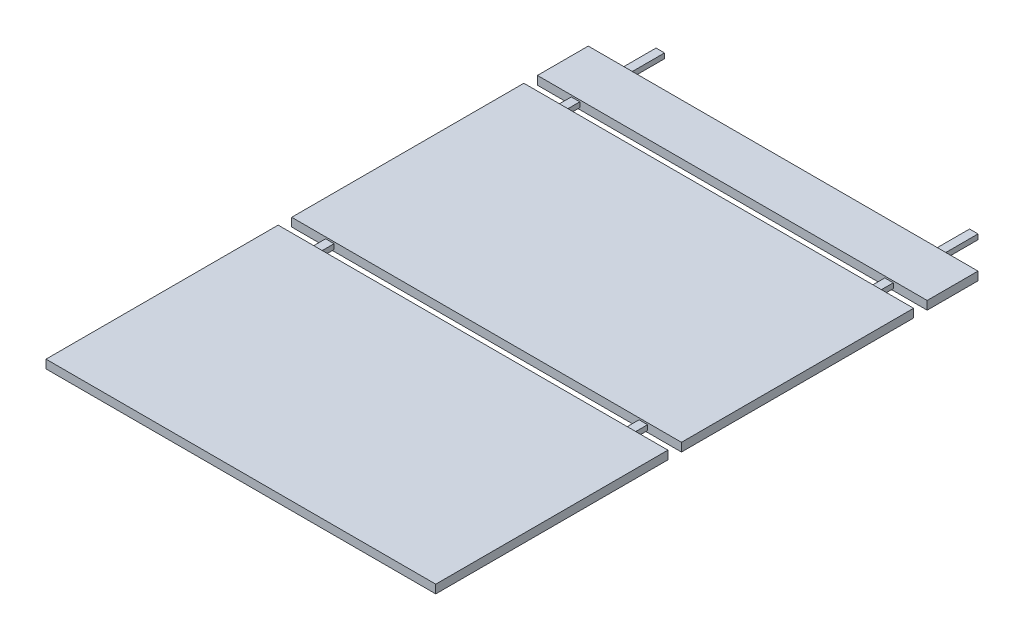
ISO-10303-21;
HEADER;
FILE_DESCRIPTION(('STEP AP214'),'2;1');
FILE_NAME('part.step','',(''),(''),'','','');
FILE_SCHEMA(('AUTOMOTIVE_DESIGN { 1 0 10303 214 1 1 1 1 }'));
ENDSEC;
DATA;
#1=APPLICATION_CONTEXT('core data for automotive mechanical design processes');
#2=APPLICATION_PROTOCOL_DEFINITION('international standard','automotive_design',2000,#1);
#3=PRODUCT_CONTEXT('',#1,'mechanical');
#4=PRODUCT('Part','Part','',(#3));
#5=PRODUCT_RELATED_PRODUCT_CATEGORY('part','',(#4));
#6=PRODUCT_DEFINITION_FORMATION('','',#4);
#7=PRODUCT_DEFINITION_CONTEXT('part definition',#1,'design');
#8=PRODUCT_DEFINITION('design','',#6,#7);
#9=PRODUCT_DEFINITION_SHAPE('','',#8);
#10=(LENGTH_UNIT() NAMED_UNIT(*) SI_UNIT(.MILLI.,.METRE.));
#11=(NAMED_UNIT(*) PLANE_ANGLE_UNIT() SI_UNIT($,.RADIAN.));
#12=(NAMED_UNIT(*) SI_UNIT($,.STERADIAN.) SOLID_ANGLE_UNIT());
#13=UNCERTAINTY_MEASURE_WITH_UNIT(LENGTH_MEASURE(1.E-05),#10,'distance_accuracy_value','');
#14=(GEOMETRIC_REPRESENTATION_CONTEXT(3) GLOBAL_UNCERTAINTY_ASSIGNED_CONTEXT((#13)) GLOBAL_UNIT_ASSIGNED_CONTEXT((#10,
#11,#12)) REPRESENTATION_CONTEXT('',''));
#15=CARTESIAN_POINT('',(0.,0.,0.));
#16=DIRECTION('',(0.,0.,1.));
#17=DIRECTION('',(1.,0.,0.));
#18=AXIS2_PLACEMENT_3D('',#15,#16,#17);
#19=CARTESIAN_POINT('',(-1150.,25.,3400.));
#20=DIRECTION('',(0.,-1.,0.));
#21=DIRECTION('',(0.,0.,-1.));
#22=AXIS2_PLACEMENT_3D('',#19,#20,#21);
#23=PLANE('',#22);
#24=DIRECTION('',(1.,0.,0.));
#25=VECTOR('',#24,1.);
#26=CARTESIAN_POINT('',(950.,25.,580.));
#27=LINE('',#26,#25);
#28=CARTESIAN_POINT('',(-1150.,25.,580.));
#29=VERTEX_POINT('',#28);
#30=CARTESIAN_POINT('',(1150.,25.,580.));
#31=VERTEX_POINT('',#30);
#32=EDGE_CURVE('E446',#29,#31,#27,.T.);
#33=ORIENTED_EDGE('',*,*,#32,.F.);
#34=DIRECTION('',(0.,0.,-1.));
#35=VECTOR('',#34,1.);
#36=CARTESIAN_POINT('',(-1150.,25.,3400.));
#37=LINE('',#36,#35);
#38=CARTESIAN_POINT('',(-1150.,25.,1950.));
#39=VERTEX_POINT('',#38);
#40=EDGE_CURVE('E346',#39,#29,#37,.T.);
#41=ORIENTED_EDGE('',*,*,#40,.F.);
#42=DIRECTION('',(-1.,0.,0.));
#43=VECTOR('',#42,1.);
#44=CARTESIAN_POINT('',(950.,25.,1950.));
#45=LINE('',#44,#43);
#46=CARTESIAN_POINT('',(1150.,25.,1950.));
#47=VERTEX_POINT('',#46);
#48=EDGE_CURVE('E322',#47,#39,#45,.T.);
#49=ORIENTED_EDGE('',*,*,#48,.F.);
#50=DIRECTION('',(0.,0.,-1.));
#51=VECTOR('',#50,1.);
#52=CARTESIAN_POINT('',(1150.,25.,3400.));
#53=LINE('',#52,#51);
#54=EDGE_CURVE('E351',#47,#31,#53,.T.);
#55=ORIENTED_EDGE('',*,*,#54,.T.);
#56=EDGE_LOOP('',(#33,#41,#49,#55));
#57=FACE_BOUND('',#56,.T.);
#58=ADVANCED_FACE('F37',(#57),#23,.F.);
#59=DIRECTION('',(1.,0.,0.));
#60=VECTOR('',#59,1.);
#61=CARTESIAN_POINT('',(950.,25.,2030.));
#62=LINE('',#61,#60);
#63=CARTESIAN_POINT('',(-1150.,25.,2030.));
#64=VERTEX_POINT('',#63);
#65=CARTESIAN_POINT('',(1150.,25.,2030.));
#66=VERTEX_POINT('',#65);
#67=EDGE_CURVE('E382',#64,#66,#62,.T.);
#68=ORIENTED_EDGE('',*,*,#67,.F.);
#69=CARTESIAN_POINT('',(-1150.,25.,3400.));
#70=VERTEX_POINT('',#69);
#71=EDGE_CURVE('E342',#70,#64,#37,.T.);
#72=ORIENTED_EDGE('',*,*,#71,.F.);
#73=DIRECTION('',(-1.,0.,0.));
#74=VECTOR('',#73,1.);
#75=CARTESIAN_POINT('',(-1150.,25.,3400.));
#76=LINE('',#75,#74);
#77=CARTESIAN_POINT('',(1150.,25.,3400.));
#78=VERTEX_POINT('',#77);
#79=EDGE_CURVE('E325',#78,#70,#76,.T.);
#80=ORIENTED_EDGE('',*,*,#79,.F.);
#81=EDGE_CURVE('E347',#78,#66,#53,.T.);
#82=ORIENTED_EDGE('',*,*,#81,.T.);
#83=EDGE_LOOP('',(#68,#72,#80,#82));
#84=FACE_BOUND('',#83,.T.);
#85=ADVANCED_FACE('F616',(#84),#23,.F.);
#86=CARTESIAN_POINT('',(-1150.,-25.,3400.));
#87=DIRECTION('',(0.,1.,0.));
#88=DIRECTION('',(0.,0.,1.));
#89=AXIS2_PLACEMENT_3D('',#86,#87,#88);
#90=PLANE('',#89);
#91=DIRECTION('',(-1.,0.,0.));
#92=VECTOR('',#91,1.);
#93=CARTESIAN_POINT('',(950.,-25.,500.));
#94=LINE('',#93,#92);
#95=CARTESIAN_POINT('',(1150.,-25.,500.));
#96=VERTEX_POINT('',#95);
#97=CARTESIAN_POINT('',(-1150.,-25.,500.));
#98=VERTEX_POINT('',#97);
#99=EDGE_CURVE('E413',#96,#98,#94,.T.);
#100=ORIENTED_EDGE('',*,*,#99,.T.);
#101=DIRECTION('',(0.,0.,-1.));
#102=VECTOR('',#101,1.);
#103=CARTESIAN_POINT('',(-1150.,-25.,3400.));
#104=LINE('',#103,#102);
#105=CARTESIAN_POINT('',(-1150.,-25.,200.));
#106=VERTEX_POINT('',#105);
#107=EDGE_CURVE('E335',#98,#106,#104,.T.);
#108=ORIENTED_EDGE('',*,*,#107,.T.);
#109=DIRECTION('',(1.,0.,0.));
#110=VECTOR('',#109,1.);
#111=CARTESIAN_POINT('',(-1150.,-25.,200.));
#112=LINE('',#111,#110);
#113=CARTESIAN_POINT('',(1150.,-25.,200.));
#114=VERTEX_POINT('',#113);
#115=EDGE_CURVE('E411',#106,#114,#112,.T.);
#116=ORIENTED_EDGE('',*,*,#115,.T.);
#117=DIRECTION('',(0.,0.,-1.));
#118=VECTOR('',#117,1.);
#119=CARTESIAN_POINT('',(1150.,-25.,3400.));
#120=LINE('',#119,#118);
#121=EDGE_CURVE('E331',#96,#114,#120,.T.);
#122=ORIENTED_EDGE('',*,*,#121,.F.);
#123=EDGE_LOOP('',(#100,#108,#116,#122));
#124=FACE_BOUND('',#123,.T.);
#125=ADVANCED_FACE('F409',(#124),#90,.F.);
#126=CARTESIAN_POINT('',(-1150.,-25.,1950.));
#127=VERTEX_POINT('',#126);
#128=CARTESIAN_POINT('',(-1150.,-25.,580.));
#129=VERTEX_POINT('',#128);
#130=EDGE_CURVE('E341',#127,#129,#104,.T.);
#131=ORIENTED_EDGE('',*,*,#130,.T.);
#132=DIRECTION('',(1.,0.,0.));
#133=VECTOR('',#132,1.);
#134=CARTESIAN_POINT('',(950.,-25.,580.));
#135=LINE('',#134,#133);
#136=CARTESIAN_POINT('',(1150.,-25.,580.));
#137=VERTEX_POINT('',#136);
#138=EDGE_CURVE('E449',#129,#137,#135,.T.);
#139=ORIENTED_EDGE('',*,*,#138,.T.);
#140=CARTESIAN_POINT('',(1150.,-25.,1950.));
#141=VERTEX_POINT('',#140);
#142=EDGE_CURVE('E336',#141,#137,#120,.T.);
#143=ORIENTED_EDGE('',*,*,#142,.F.);
#144=DIRECTION('',(-1.,0.,0.));
#145=VECTOR('',#144,1.);
#146=CARTESIAN_POINT('',(950.,-25.,1950.));
#147=LINE('',#146,#145);
#148=EDGE_CURVE('E385',#141,#127,#147,.T.);
#149=ORIENTED_EDGE('',*,*,#148,.T.);
#150=EDGE_LOOP('',(#131,#139,#143,#149));
#151=FACE_BOUND('',#150,.T.);
#152=ADVANCED_FACE('F393',(#151),#90,.F.);
#153=CARTESIAN_POINT('',(1150.,-25.,3400.));
#154=DIRECTION('',(-1.,0.,0.));
#155=DIRECTION('',(0.,0.,1.));
#156=AXIS2_PLACEMENT_3D('',#153,#154,#155);
#157=PLANE('',#156);
#158=CARTESIAN_POINT('',(1150.,25.,500.));
#159=VERTEX_POINT('',#158);
#160=CARTESIAN_POINT('',(1150.,25.,200.));
#161=VERTEX_POINT('',#160);
#162=EDGE_CURVE('E345',#159,#161,#53,.T.);
#163=ORIENTED_EDGE('',*,*,#162,.F.);
#164=DIRECTION('',(0.,1.,0.));
#165=VECTOR('',#164,1.);
#166=CARTESIAN_POINT('',(1150.,-25.,500.));
#167=LINE('',#166,#165);
#168=EDGE_CURVE('E435',#96,#159,#167,.T.);
#169=ORIENTED_EDGE('',*,*,#168,.F.);
#170=ORIENTED_EDGE('',*,*,#121,.T.);
#171=DIRECTION('',(0.,1.,0.));
#172=VECTOR('',#171,1.);
#173=CARTESIAN_POINT('',(1150.,-25.,200.));
#174=LINE('',#173,#172);
#175=EDGE_CURVE('E491',#114,#161,#174,.T.);
#176=ORIENTED_EDGE('',*,*,#175,.T.);
#177=EDGE_LOOP('',(#163,#169,#170,#176));
#178=FACE_BOUND('',#177,.T.);
#179=ADVANCED_FACE('F635',(#178),#157,.F.);
#180=ORIENTED_EDGE('',*,*,#142,.T.);
#181=DIRECTION('',(0.,1.,0.));
#182=VECTOR('',#181,1.);
#183=CARTESIAN_POINT('',(1150.,-25.,580.));
#184=LINE('',#183,#182);
#185=EDGE_CURVE('E437',#137,#31,#184,.T.);
#186=ORIENTED_EDGE('',*,*,#185,.T.);
#187=ORIENTED_EDGE('',*,*,#54,.F.);
#188=DIRECTION('',(0.,1.,0.));
#189=VECTOR('',#188,1.);
#190=CARTESIAN_POINT('',(1150.,-25.,1950.));
#191=LINE('',#190,#189);
#192=EDGE_CURVE('E302',#141,#47,#191,.T.);
#193=ORIENTED_EDGE('',*,*,#192,.F.);
#194=EDGE_LOOP('',(#180,#186,#187,#193));
#195=FACE_BOUND('',#194,.T.);
#196=ADVANCED_FACE('F636',(#195),#157,.F.);
#197=CARTESIAN_POINT('',(-1150.,-25.,3400.));
#198=DIRECTION('',(1.,0.,0.));
#199=DIRECTION('',(0.,0.,-1.));
#200=AXIS2_PLACEMENT_3D('',#197,#198,#199);
#201=PLANE('',#200);
#202=CARTESIAN_POINT('',(-1150.,25.,500.));
#203=VERTEX_POINT('',#202);
#204=CARTESIAN_POINT('',(-1150.,25.,200.));
#205=VERTEX_POINT('',#204);
#206=EDGE_CURVE('E340',#203,#205,#37,.T.);
#207=ORIENTED_EDGE('',*,*,#206,.T.);
#208=DIRECTION('',(0.,1.,0.));
#209=VECTOR('',#208,1.);
#210=CARTESIAN_POINT('',(-1150.,-25.,200.));
#211=LINE('',#210,#209);
#212=EDGE_CURVE('E420',#106,#205,#211,.T.);
#213=ORIENTED_EDGE('',*,*,#212,.F.);
#214=ORIENTED_EDGE('',*,*,#107,.F.);
#215=DIRECTION('',(0.,1.,0.));
#216=VECTOR('',#215,1.);
#217=CARTESIAN_POINT('',(-1150.,-25.,500.));
#218=LINE('',#217,#216);
#219=EDGE_CURVE('E304',#98,#203,#218,.T.);
#220=ORIENTED_EDGE('',*,*,#219,.T.);
#221=EDGE_LOOP('',(#207,#213,#214,#220));
#222=FACE_BOUND('',#221,.T.);
#223=ADVANCED_FACE('F418',(#222),#201,.F.);
#224=ORIENTED_EDGE('',*,*,#40,.T.);
#225=DIRECTION('',(0.,1.,0.));
#226=VECTOR('',#225,1.);
#227=CARTESIAN_POINT('',(-1150.,-25.,580.));
#228=LINE('',#227,#226);
#229=EDGE_CURVE('E298',#129,#29,#228,.T.);
#230=ORIENTED_EDGE('',*,*,#229,.F.);
#231=ORIENTED_EDGE('',*,*,#130,.F.);
#232=DIRECTION('',(0.,1.,0.));
#233=VECTOR('',#232,1.);
#234=CARTESIAN_POINT('',(-1150.,-25.,1950.));
#235=LINE('',#234,#233);
#236=EDGE_CURVE('E311',#127,#39,#235,.T.);
#237=ORIENTED_EDGE('',*,*,#236,.T.);
#238=EDGE_LOOP('',(#224,#230,#231,#237));
#239=FACE_BOUND('',#238,.T.);
#240=ADVANCED_FACE('F405',(#239),#201,.F.);
#241=CARTESIAN_POINT('',(0.,0.,0.));
#242=DIRECTION('',(0.,0.,-1.));
#243=DIRECTION('',(-1.,0.,0.));
#244=AXIS2_PLACEMENT_3D('',#241,#242,#243);
#245=PLANE('',#244);
#246=DIRECTION('',(1.,0.,0.));
#247=VECTOR('',#246,1.);
#248=CARTESIAN_POINT('',(-1150.,15.,0.));
#249=LINE('',#248,#247);
#250=CARTESIAN_POINT('',(-950.,15.,0.));
#251=VERTEX_POINT('',#250);
#252=CARTESIAN_POINT('',(-900.,15.,0.));
#253=VERTEX_POINT('',#252);
#254=EDGE_CURVE('E564',#251,#253,#249,.T.);
#255=ORIENTED_EDGE('',*,*,#254,.T.);
#256=DIRECTION('',(0.,1.,0.));
#257=VECTOR('',#256,1.);
#258=CARTESIAN_POINT('',(-900.,-25.,0.));
#259=LINE('',#258,#257);
#260=CARTESIAN_POINT('',(-900.,-14.9999999999998,0.));
#261=VERTEX_POINT('',#260);
#262=EDGE_CURVE('E479',#261,#253,#259,.T.);
#263=ORIENTED_EDGE('',*,*,#262,.F.);
#264=DIRECTION('',(1.,0.,0.));
#265=VECTOR('',#264,1.);
#266=CARTESIAN_POINT('',(-1150.,-14.9999999999998,0.));
#267=LINE('',#266,#265);
#268=CARTESIAN_POINT('',(-950.,-14.9999999999998,0.));
#269=VERTEX_POINT('',#268);
#270=EDGE_CURVE('E565',#269,#261,#267,.T.);
#271=ORIENTED_EDGE('',*,*,#270,.F.);
#272=DIRECTION('',(0.,1.,0.));
#273=VECTOR('',#272,1.);
#274=CARTESIAN_POINT('',(-950.,-25.,0.));
#275=LINE('',#274,#273);
#276=EDGE_CURVE('E427',#269,#251,#275,.T.);
#277=ORIENTED_EDGE('',*,*,#276,.T.);
#278=EDGE_LOOP('',(#255,#263,#271,#277));
#279=FACE_BOUND('',#278,.T.);
#280=ADVANCED_FACE('F593',(#279),#245,.T.);
#281=CARTESIAN_POINT('',(1150.,-25.,3400.));
#282=VERTEX_POINT('',#281);
#283=CARTESIAN_POINT('',(1150.,-25.,2030.));
#284=VERTEX_POINT('',#283);
#285=EDGE_CURVE('E332',#282,#284,#120,.T.);
#286=ORIENTED_EDGE('',*,*,#285,.T.);
#287=DIRECTION('',(0.,1.,0.));
#288=VECTOR('',#287,1.);
#289=CARTESIAN_POINT('',(1150.,-25.,2030.));
#290=LINE('',#289,#288);
#291=EDGE_CURVE('E374',#284,#66,#290,.T.);
#292=ORIENTED_EDGE('',*,*,#291,.T.);
#293=ORIENTED_EDGE('',*,*,#81,.F.);
#294=DIRECTION('',(0.,1.,0.));
#295=VECTOR('',#294,1.);
#296=CARTESIAN_POINT('',(1150.,-25.,3400.));
#297=LINE('',#296,#295);
#298=EDGE_CURVE('E313',#282,#78,#297,.T.);
#299=ORIENTED_EDGE('',*,*,#298,.F.);
#300=EDGE_LOOP('',(#286,#292,#293,#299));
#301=FACE_BOUND('',#300,.T.);
#302=ADVANCED_FACE('F39',(#301),#157,.F.);
#303=ORIENTED_EDGE('',*,*,#162,.T.);
#304=DIRECTION('',(1.,0.,0.));
#305=VECTOR('',#304,1.);
#306=CARTESIAN_POINT('',(-1150.,25.,200.));
#307=LINE('',#306,#305);
#308=EDGE_CURVE('E425',#205,#161,#307,.T.);
#309=ORIENTED_EDGE('',*,*,#308,.F.);
#310=ORIENTED_EDGE('',*,*,#206,.F.);
#311=DIRECTION('',(-1.,0.,0.));
#312=VECTOR('',#311,1.);
#313=CARTESIAN_POINT('',(950.,25.,500.));
#314=LINE('',#313,#312);
#315=EDGE_CURVE('E310',#159,#203,#314,.T.);
#316=ORIENTED_EDGE('',*,*,#315,.F.);
#317=EDGE_LOOP('',(#303,#309,#310,#316));
#318=FACE_BOUND('',#317,.T.);
#319=ADVANCED_FACE('F618',(#318),#23,.F.);
#320=ORIENTED_EDGE('',*,*,#71,.T.);
#321=DIRECTION('',(0.,1.,0.));
#322=VECTOR('',#321,1.);
#323=CARTESIAN_POINT('',(-1150.,-25.,2030.));
#324=LINE('',#323,#322);
#325=CARTESIAN_POINT('',(-1150.,-25.,2030.));
#326=VERTEX_POINT('',#325);
#327=EDGE_CURVE('E320',#326,#64,#324,.T.);
#328=ORIENTED_EDGE('',*,*,#327,.F.);
#329=CARTESIAN_POINT('',(-1150.,-25.,3400.));
#330=VERTEX_POINT('',#329);
#331=EDGE_CURVE('E337',#330,#326,#104,.T.);
#332=ORIENTED_EDGE('',*,*,#331,.F.);
#333=DIRECTION('',(0.,-1.,0.));
#334=VECTOR('',#333,1.);
#335=CARTESIAN_POINT('',(-1150.,-25.,3400.));
#336=LINE('',#335,#334);
#337=EDGE_CURVE('E327',#70,#330,#336,.T.);
#338=ORIENTED_EDGE('',*,*,#337,.F.);
#339=EDGE_LOOP('',(#320,#328,#332,#338));
#340=FACE_BOUND('',#339,.T.);
#341=ADVANCED_FACE('F626',(#340),#201,.F.);
#342=ORIENTED_EDGE('',*,*,#331,.T.);
#343=DIRECTION('',(1.,0.,0.));
#344=VECTOR('',#343,1.);
#345=CARTESIAN_POINT('',(950.,-25.,2030.));
#346=LINE('',#345,#344);
#347=EDGE_CURVE('E376',#326,#284,#346,.T.);
#348=ORIENTED_EDGE('',*,*,#347,.T.);
#349=ORIENTED_EDGE('',*,*,#285,.F.);
#350=DIRECTION('',(1.,0.,0.));
#351=VECTOR('',#350,1.);
#352=CARTESIAN_POINT('',(-1150.,-25.,3400.));
#353=LINE('',#352,#351);
#354=EDGE_CURVE('E329',#330,#282,#353,.T.);
#355=ORIENTED_EDGE('',*,*,#354,.F.);
#356=EDGE_LOOP('',(#342,#348,#349,#355));
#357=FACE_BOUND('',#356,.T.);
#358=ADVANCED_FACE('F632',(#357),#90,.F.);
#359=CARTESIAN_POINT('',(0.,0.,3400.));
#360=DIRECTION('',(0.,0.,-1.));
#361=DIRECTION('',(-1.,0.,0.));
#362=AXIS2_PLACEMENT_3D('',#359,#360,#361);
#363=PLANE('',#362);
#364=ORIENTED_EDGE('',*,*,#298,.T.);
#365=ORIENTED_EDGE('',*,*,#79,.T.);
#366=ORIENTED_EDGE('',*,*,#337,.T.);
#367=ORIENTED_EDGE('',*,*,#354,.T.);
#368=EDGE_LOOP('',(#364,#365,#366,#367));
#369=FACE_BOUND('',#368,.T.);
#370=ADVANCED_FACE('F679',(#369),#363,.F.);
#371=CARTESIAN_POINT('',(899.999999999999,15.,0.));
#372=VERTEX_POINT('',#371);
#373=CARTESIAN_POINT('',(949.999999999999,15.,0.));
#374=VERTEX_POINT('',#373);
#375=EDGE_CURVE('E561',#372,#374,#249,.T.);
#376=ORIENTED_EDGE('',*,*,#375,.T.);
#377=DIRECTION('',(0.,1.,0.));
#378=VECTOR('',#377,1.);
#379=CARTESIAN_POINT('',(950.,-25.,0.));
#380=LINE('',#379,#378);
#381=CARTESIAN_POINT('',(950.,-14.9999999999998,0.));
#382=VERTEX_POINT('',#381);
#383=EDGE_CURVE('E434',#382,#374,#380,.T.);
#384=ORIENTED_EDGE('',*,*,#383,.F.);
#385=CARTESIAN_POINT('',(899.999999999999,-14.9999999999998,0.));
#386=VERTEX_POINT('',#385);
#387=EDGE_CURVE('E52',#386,#382,#267,.T.);
#388=ORIENTED_EDGE('',*,*,#387,.F.);
#389=DIRECTION('',(0.,1.,0.));
#390=VECTOR('',#389,1.);
#391=CARTESIAN_POINT('',(900.,-25.,0.));
#392=LINE('',#391,#390);
#393=EDGE_CURVE('E482',#386,#372,#392,.T.);
#394=ORIENTED_EDGE('',*,*,#393,.T.);
#395=EDGE_LOOP('',(#376,#384,#388,#394));
#396=FACE_BOUND('',#395,.T.);
#397=ADVANCED_FACE('F682',(#396),#245,.T.);
#398=CARTESIAN_POINT('',(-900.,-25.,0.));
#399=DIRECTION('',(-1.,0.,0.));
#400=DIRECTION('',(0.,0.,1.));
#401=AXIS2_PLACEMENT_3D('',#398,#399,#400);
#402=PLANE('',#401);
#403=ORIENTED_EDGE('',*,*,#262,.T.);
#404=DIRECTION('',(0.,0.,1.));
#405=VECTOR('',#404,1.);
#406=CARTESIAN_POINT('',(-900.,15.,0.));
#407=LINE('',#406,#405);
#408=CARTESIAN_POINT('',(-900.,15.,200.));
#409=VERTEX_POINT('',#408);
#410=EDGE_CURVE('E459',#253,#409,#407,.T.);
#411=ORIENTED_EDGE('',*,*,#410,.T.);
#412=DIRECTION('',(0.,1.,0.));
#413=VECTOR('',#412,1.);
#414=CARTESIAN_POINT('',(-900.,-25.,200.));
#415=LINE('',#414,#413);
#416=CARTESIAN_POINT('',(-900.,-14.9999999999998,200.));
#417=VERTEX_POINT('',#416);
#418=EDGE_CURVE('E488',#417,#409,#415,.T.);
#419=ORIENTED_EDGE('',*,*,#418,.F.);
#420=DIRECTION('',(0.,0.,-1.));
#421=VECTOR('',#420,1.);
#422=CARTESIAN_POINT('',(-900.,-14.9999999999998,0.));
#423=LINE('',#422,#421);
#424=EDGE_CURVE('E508',#417,#261,#423,.T.);
#425=ORIENTED_EDGE('',*,*,#424,.T.);
#426=EDGE_LOOP('',(#403,#411,#419,#425));
#427=FACE_BOUND('',#426,.T.);
#428=ADVANCED_FACE('F587',(#427),#402,.F.);
#429=CARTESIAN_POINT('',(900.,-25.,0.));
#430=DIRECTION('',(1.,0.,0.));
#431=DIRECTION('',(0.,0.,-1.));
#432=AXIS2_PLACEMENT_3D('',#429,#430,#431);
#433=PLANE('',#432);
#434=DIRECTION('',(0.,1.,0.));
#435=VECTOR('',#434,1.);
#436=CARTESIAN_POINT('',(900.,-25.,200.));
#437=LINE('',#436,#435);
#438=CARTESIAN_POINT('',(899.999999999999,-14.9999999999998,200.));
#439=VERTEX_POINT('',#438);
#440=CARTESIAN_POINT('',(899.999999999999,15.,200.));
#441=VERTEX_POINT('',#440);
#442=EDGE_CURVE('E485',#439,#441,#437,.T.);
#443=ORIENTED_EDGE('',*,*,#442,.T.);
#444=DIRECTION('',(0.,0.,-1.));
#445=VECTOR('',#444,1.);
#446=CARTESIAN_POINT('',(900.,15.,0.));
#447=LINE('',#446,#445);
#448=EDGE_CURVE('E500',#441,#372,#447,.T.);
#449=ORIENTED_EDGE('',*,*,#448,.T.);
#450=ORIENTED_EDGE('',*,*,#393,.F.);
#451=DIRECTION('',(0.,0.,1.));
#452=VECTOR('',#451,1.);
#453=CARTESIAN_POINT('',(900.,-14.9999999999998,0.));
#454=LINE('',#453,#452);
#455=EDGE_CURVE('E511',#386,#439,#454,.T.);
#456=ORIENTED_EDGE('',*,*,#455,.T.);
#457=EDGE_LOOP('',(#443,#449,#450,#456));
#458=FACE_BOUND('',#457,.T.);
#459=ADVANCED_FACE('F775',(#458),#433,.F.);
#460=CARTESIAN_POINT('',(950.,-25.,200.));
#461=DIRECTION('',(-1.,0.,0.));
#462=DIRECTION('',(0.,0.,1.));
#463=AXIS2_PLACEMENT_3D('',#460,#461,#462);
#464=PLANE('',#463);
#465=ORIENTED_EDGE('',*,*,#383,.T.);
#466=DIRECTION('',(0.,0.,1.));
#467=VECTOR('',#466,1.);
#468=CARTESIAN_POINT('',(950.,15.,200.));
#469=LINE('',#468,#467);
#470=CARTESIAN_POINT('',(950.,15.,200.));
#471=VERTEX_POINT('',#470);
#472=EDGE_CURVE('E503',#374,#471,#469,.T.);
#473=ORIENTED_EDGE('',*,*,#472,.T.);
#474=DIRECTION('',(0.,1.,0.));
#475=VECTOR('',#474,1.);
#476=CARTESIAN_POINT('',(950.,-25.,200.));
#477=LINE('',#476,#475);
#478=CARTESIAN_POINT('',(949.999999999999,-14.9999999999998,200.));
#479=VERTEX_POINT('',#478);
#480=EDGE_CURVE('E493',#479,#471,#477,.T.);
#481=ORIENTED_EDGE('',*,*,#480,.F.);
#482=DIRECTION('',(0.,0.,-1.));
#483=VECTOR('',#482,1.);
#484=CARTESIAN_POINT('',(950.,-14.9999999999998,200.));
#485=LINE('',#484,#483);
#486=EDGE_CURVE('E514',#479,#382,#485,.T.);
#487=ORIENTED_EDGE('',*,*,#486,.T.);
#488=EDGE_LOOP('',(#465,#473,#481,#487));
#489=FACE_BOUND('',#488,.T.);
#490=ADVANCED_FACE('F663',(#489),#464,.F.);
#491=CARTESIAN_POINT('',(-950.,-25.,200.));
#492=DIRECTION('',(1.,0.,0.));
#493=DIRECTION('',(0.,0.,-1.));
#494=AXIS2_PLACEMENT_3D('',#491,#492,#493);
#495=PLANE('',#494);
#496=DIRECTION('',(0.,1.,0.));
#497=VECTOR('',#496,1.);
#498=CARTESIAN_POINT('',(-950.,-25.,200.));
#499=LINE('',#498,#497);
#500=CARTESIAN_POINT('',(-950.,-14.9999999999998,200.));
#501=VERTEX_POINT('',#500);
#502=CARTESIAN_POINT('',(-950.,15.,200.));
#503=VERTEX_POINT('',#502);
#504=EDGE_CURVE('E423',#501,#503,#499,.T.);
#505=ORIENTED_EDGE('',*,*,#504,.T.);
#506=DIRECTION('',(0.,0.,-1.));
#507=VECTOR('',#506,1.);
#508=CARTESIAN_POINT('',(-950.,15.,200.));
#509=LINE('',#508,#507);
#510=EDGE_CURVE('E505',#503,#251,#509,.T.);
#511=ORIENTED_EDGE('',*,*,#510,.T.);
#512=ORIENTED_EDGE('',*,*,#276,.F.);
#513=DIRECTION('',(0.,0.,1.));
#514=VECTOR('',#513,1.);
#515=CARTESIAN_POINT('',(-950.,-14.9999999999998,200.));
#516=LINE('',#515,#514);
#517=EDGE_CURVE('E516',#269,#501,#516,.T.);
#518=ORIENTED_EDGE('',*,*,#517,.T.);
#519=EDGE_LOOP('',(#505,#511,#512,#518));
#520=FACE_BOUND('',#519,.T.);
#521=ADVANCED_FACE('F597',(#520),#495,.F.);
#522=CARTESIAN_POINT('',(-1150.,-25.,200.));
#523=DIRECTION('',(0.,0.,1.));
#524=DIRECTION('',(1.,0.,0.));
#525=AXIS2_PLACEMENT_3D('',#522,#523,#524);
#526=PLANE('',#525);
#527=ORIENTED_EDGE('',*,*,#308,.T.);
#528=ORIENTED_EDGE('',*,*,#175,.F.);
#529=ORIENTED_EDGE('',*,*,#115,.F.);
#530=ORIENTED_EDGE('',*,*,#212,.T.);
#531=EDGE_LOOP('',(#527,#528,#529,#530));
#532=FACE_BOUND('',#531,.T.);
#533=ORIENTED_EDGE('',*,*,#418,.T.);
#534=DIRECTION('',(1.,0.,0.));
#535=VECTOR('',#534,1.);
#536=CARTESIAN_POINT('',(-1150.,15.,200.));
#537=LINE('',#536,#535);
#538=EDGE_CURVE('E567',#503,#409,#537,.T.);
#539=ORIENTED_EDGE('',*,*,#538,.F.);
#540=ORIENTED_EDGE('',*,*,#504,.F.);
#541=DIRECTION('',(1.,0.,0.));
#542=VECTOR('',#541,1.);
#543=CARTESIAN_POINT('',(-1150.,-14.9999999999998,200.));
#544=LINE('',#543,#542);
#545=EDGE_CURVE('E577',#501,#417,#544,.T.);
#546=ORIENTED_EDGE('',*,*,#545,.T.);
#547=EDGE_LOOP('',(#533,#539,#540,#546));
#548=FACE_BOUND('',#547,.T.);
#549=EDGE_CURVE('E60',#441,#471,#537,.T.);
#550=ORIENTED_EDGE('',*,*,#549,.F.);
#551=ORIENTED_EDGE('',*,*,#442,.F.);
#552=EDGE_CURVE('E574',#439,#479,#544,.T.);
#553=ORIENTED_EDGE('',*,*,#552,.T.);
#554=ORIENTED_EDGE('',*,*,#480,.T.);
#555=EDGE_LOOP('',(#550,#551,#553,#554));
#556=FACE_BOUND('',#555,.T.);
#557=ADVANCED_FACE('F582',(#532,#548,#556),#526,.F.);
#558=CARTESIAN_POINT('',(-950.,-25.,2030.));
#559=DIRECTION('',(1.,0.,0.));
#560=DIRECTION('',(0.,0.,-1.));
#561=AXIS2_PLACEMENT_3D('',#558,#559,#560);
#562=PLANE('',#561);
#563=DIRECTION('',(0.,1.,0.));
#564=VECTOR('',#563,1.);
#565=CARTESIAN_POINT('',(-950.,-25.,1950.));
#566=LINE('',#565,#564);
#567=CARTESIAN_POINT('',(-950.,-15.,1950.));
#568=VERTEX_POINT('',#567);
#569=CARTESIAN_POINT('',(-950.,15.,1950.));
#570=VERTEX_POINT('',#569);
#571=EDGE_CURVE('E314',#568,#570,#566,.T.);
#572=ORIENTED_EDGE('',*,*,#571,.F.);
#573=DIRECTION('',(0.,0.,1.));
#574=VECTOR('',#573,1.);
#575=CARTESIAN_POINT('',(-950.,-15.,2030.));
#576=LINE('',#575,#574);
#577=CARTESIAN_POINT('',(-950.,-15.,2030.));
#578=VERTEX_POINT('',#577);
#579=EDGE_CURVE('E519',#568,#578,#576,.T.);
#580=ORIENTED_EDGE('',*,*,#579,.T.);
#581=DIRECTION('',(0.,1.,0.));
#582=VECTOR('',#581,1.);
#583=CARTESIAN_POINT('',(-950.,-25.,2030.));
#584=LINE('',#583,#582);
#585=CARTESIAN_POINT('',(-950.,15.,2030.));
#586=VERTEX_POINT('',#585);
#587=EDGE_CURVE('E317',#578,#586,#584,.T.);
#588=ORIENTED_EDGE('',*,*,#587,.T.);
#589=DIRECTION('',(0.,0.,-1.));
#590=VECTOR('',#589,1.);
#591=CARTESIAN_POINT('',(-950.,15.,2030.));
#592=LINE('',#591,#590);
#593=EDGE_CURVE('E528',#586,#570,#592,.T.);
#594=ORIENTED_EDGE('',*,*,#593,.T.);
#595=EDGE_LOOP('',(#572,#580,#588,#594));
#596=FACE_BOUND('',#595,.T.);
#597=ADVANCED_FACE('F660',(#596),#562,.F.);
#598=CARTESIAN_POINT('',(-900.,-25.,580.));
#599=DIRECTION('',(-1.,0.,0.));
#600=DIRECTION('',(0.,0.,1.));
#601=AXIS2_PLACEMENT_3D('',#598,#599,#600);
#602=PLANE('',#601);
#603=DIRECTION('',(0.,1.,0.));
#604=VECTOR('',#603,1.);
#605=CARTESIAN_POINT('',(-900.,-25.,580.));
#606=LINE('',#605,#604);
#607=CARTESIAN_POINT('',(-900.,-14.9999999999998,580.));
#608=VERTEX_POINT('',#607);
#609=CARTESIAN_POINT('',(-900.,15.,580.));
#610=VERTEX_POINT('',#609);
#611=EDGE_CURVE('E291',#608,#610,#606,.T.);
#612=ORIENTED_EDGE('',*,*,#611,.F.);
#613=DIRECTION('',(0.,0.,-1.));
#614=VECTOR('',#613,1.);
#615=CARTESIAN_POINT('',(-900.,-14.9999999999998,580.));
#616=LINE('',#615,#614);
#617=CARTESIAN_POINT('',(-900.,-14.9999999999998,500.));
#618=VERTEX_POINT('',#617);
#619=EDGE_CURVE('E537',#608,#618,#616,.T.);
#620=ORIENTED_EDGE('',*,*,#619,.T.);
#621=DIRECTION('',(0.,1.,0.));
#622=VECTOR('',#621,1.);
#623=CARTESIAN_POINT('',(-900.,-25.,500.));
#624=LINE('',#623,#622);
#625=CARTESIAN_POINT('',(-900.,15.,500.));
#626=VERTEX_POINT('',#625);
#627=EDGE_CURVE('E458',#618,#626,#624,.T.);
#628=ORIENTED_EDGE('',*,*,#627,.T.);
#629=DIRECTION('',(0.,0.,1.));
#630=VECTOR('',#629,1.);
#631=CARTESIAN_POINT('',(-900.,15.,580.));
#632=LINE('',#631,#630);
#633=EDGE_CURVE('E544',#626,#610,#632,.T.);
#634=ORIENTED_EDGE('',*,*,#633,.T.);
#635=EDGE_LOOP('',(#612,#620,#628,#634));
#636=FACE_BOUND('',#635,.T.);
#637=ADVANCED_FACE('F677',(#636),#602,.F.);
#638=CARTESIAN_POINT('',(899.999999999999,-25.,580.));
#639=DIRECTION('',(1.,0.,0.));
#640=DIRECTION('',(0.,0.,-1.));
#641=AXIS2_PLACEMENT_3D('',#638,#639,#640);
#642=PLANE('',#641);
#643=DIRECTION('',(0.,1.,0.));
#644=VECTOR('',#643,1.);
#645=CARTESIAN_POINT('',(899.999999999999,-25.,500.));
#646=LINE('',#645,#644);
#647=CARTESIAN_POINT('',(899.999999999999,-14.9999999999998,500.));
#648=VERTEX_POINT('',#647);
#649=CARTESIAN_POINT('',(899.999999999999,15.,500.));
#650=VERTEX_POINT('',#649);
#651=EDGE_CURVE('E462',#648,#650,#646,.T.);
#652=ORIENTED_EDGE('',*,*,#651,.F.);
#653=DIRECTION('',(0.,0.,1.));
#654=VECTOR('',#653,1.);
#655=CARTESIAN_POINT('',(899.999999999999,-14.9999999999998,580.));
#656=LINE('',#655,#654);
#657=CARTESIAN_POINT('',(899.999999999999,-14.9999999999998,580.));
#658=VERTEX_POINT('',#657);
#659=EDGE_CURVE('E540',#648,#658,#656,.T.);
#660=ORIENTED_EDGE('',*,*,#659,.T.);
#661=DIRECTION('',(0.,1.,0.));
#662=VECTOR('',#661,1.);
#663=CARTESIAN_POINT('',(899.999999999999,-25.,580.));
#664=LINE('',#663,#662);
#665=CARTESIAN_POINT('',(899.999999999999,15.,580.));
#666=VERTEX_POINT('',#665);
#667=EDGE_CURVE('E465',#658,#666,#664,.T.);
#668=ORIENTED_EDGE('',*,*,#667,.T.);
#669=DIRECTION('',(0.,0.,-1.));
#670=VECTOR('',#669,1.);
#671=CARTESIAN_POINT('',(899.999999999999,15.,580.));
#672=LINE('',#671,#670);
#673=EDGE_CURVE('E280',#666,#650,#672,.T.);
#674=ORIENTED_EDGE('',*,*,#673,.T.);
#675=EDGE_LOOP('',(#652,#660,#668,#674));
#676=FACE_BOUND('',#675,.T.);
#677=ADVANCED_FACE('F821',(#676),#642,.F.);
#678=CARTESIAN_POINT('',(-900.,-25.,2030.));
#679=DIRECTION('',(-1.,0.,0.));
#680=DIRECTION('',(0.,0.,1.));
#681=AXIS2_PLACEMENT_3D('',#678,#679,#680);
#682=PLANE('',#681);
#683=DIRECTION('',(0.,1.,0.));
#684=VECTOR('',#683,1.);
#685=CARTESIAN_POINT('',(-900.,-25.,2030.));
#686=LINE('',#685,#684);
#687=CARTESIAN_POINT('',(-900.,-15.,2030.));
#688=VERTEX_POINT('',#687);
#689=CARTESIAN_POINT('',(-900.,15.,2030.));
#690=VERTEX_POINT('',#689);
#691=EDGE_CURVE('E468',#688,#690,#686,.T.);
#692=ORIENTED_EDGE('',*,*,#691,.F.);
#693=DIRECTION('',(0.,0.,-1.));
#694=VECTOR('',#693,1.);
#695=CARTESIAN_POINT('',(-900.,-15.,2030.));
#696=LINE('',#695,#694);
#697=CARTESIAN_POINT('',(-900.,-15.,1950.));
#698=VERTEX_POINT('',#697);
#699=EDGE_CURVE('E522',#688,#698,#696,.T.);
#700=ORIENTED_EDGE('',*,*,#699,.T.);
#701=DIRECTION('',(0.,1.,0.));
#702=VECTOR('',#701,1.);
#703=CARTESIAN_POINT('',(-900.,-25.,1950.));
#704=LINE('',#703,#702);
#705=CARTESIAN_POINT('',(-900.,15.,1950.));
#706=VERTEX_POINT('',#705);
#707=EDGE_CURVE('E471',#698,#706,#704,.T.);
#708=ORIENTED_EDGE('',*,*,#707,.T.);
#709=DIRECTION('',(0.,0.,1.));
#710=VECTOR('',#709,1.);
#711=CARTESIAN_POINT('',(-900.,15.,2030.));
#712=LINE('',#711,#710);
#713=EDGE_CURVE('E531',#706,#690,#712,.T.);
#714=ORIENTED_EDGE('',*,*,#713,.T.);
#715=EDGE_LOOP('',(#692,#700,#708,#714));
#716=FACE_BOUND('',#715,.T.);
#717=ADVANCED_FACE('F832',(#716),#682,.F.);
#718=CARTESIAN_POINT('',(899.999999999999,-25.,2030.));
#719=DIRECTION('',(1.,0.,0.));
#720=DIRECTION('',(0.,0.,-1.));
#721=AXIS2_PLACEMENT_3D('',#718,#719,#720);
#722=PLANE('',#721);
#723=DIRECTION('',(0.,1.,0.));
#724=VECTOR('',#723,1.);
#725=CARTESIAN_POINT('',(899.999999999999,-25.,1950.));
#726=LINE('',#725,#724);
#727=CARTESIAN_POINT('',(899.999999999999,-15.,1950.));
#728=VERTEX_POINT('',#727);
#729=CARTESIAN_POINT('',(899.999999999999,15.,1950.));
#730=VERTEX_POINT('',#729);
#731=EDGE_CURVE('E474',#728,#730,#726,.T.);
#732=ORIENTED_EDGE('',*,*,#731,.F.);
#733=DIRECTION('',(0.,0.,1.));
#734=VECTOR('',#733,1.);
#735=CARTESIAN_POINT('',(899.999999999999,-15.,2030.));
#736=LINE('',#735,#734);
#737=CARTESIAN_POINT('',(899.999999999999,-15.,2030.));
#738=VERTEX_POINT('',#737);
#739=EDGE_CURVE('E525',#728,#738,#736,.T.);
#740=ORIENTED_EDGE('',*,*,#739,.T.);
#741=DIRECTION('',(0.,1.,0.));
#742=VECTOR('',#741,1.);
#743=CARTESIAN_POINT('',(899.999999999999,-25.,2030.));
#744=LINE('',#743,#742);
#745=CARTESIAN_POINT('',(899.999999999999,15.,2030.));
#746=VERTEX_POINT('',#745);
#747=EDGE_CURVE('E477',#738,#746,#744,.T.);
#748=ORIENTED_EDGE('',*,*,#747,.T.);
#749=DIRECTION('',(0.,0.,-1.));
#750=VECTOR('',#749,1.);
#751=CARTESIAN_POINT('',(899.999999999999,15.,2030.));
#752=LINE('',#751,#750);
#753=EDGE_CURVE('E534',#746,#730,#752,.T.);
#754=ORIENTED_EDGE('',*,*,#753,.T.);
#755=EDGE_LOOP('',(#732,#740,#748,#754));
#756=FACE_BOUND('',#755,.T.);
#757=ADVANCED_FACE('F666',(#756),#722,.F.);
#758=CARTESIAN_POINT('',(950.,-25.,1950.));
#759=DIRECTION('',(0.,0.,-1.));
#760=DIRECTION('',(-1.,0.,0.));
#761=AXIS2_PLACEMENT_3D('',#758,#759,#760);
#762=PLANE('',#761);
#763=DIRECTION('',(1.,0.,0.));
#764=VECTOR('',#763,1.);
#765=CARTESIAN_POINT('',(-1150.,-15.,1950.));
#766=LINE('',#765,#764);
#767=EDGE_CURVE('E550',#568,#698,#766,.T.);
#768=ORIENTED_EDGE('',*,*,#767,.F.);
#769=ORIENTED_EDGE('',*,*,#571,.T.);
#770=DIRECTION('',(1.,0.,0.));
#771=VECTOR('',#770,1.);
#772=CARTESIAN_POINT('',(-1150.,15.,1950.));
#773=LINE('',#772,#771);
#774=EDGE_CURVE('E281',#570,#706,#773,.T.);
#775=ORIENTED_EDGE('',*,*,#774,.T.);
#776=ORIENTED_EDGE('',*,*,#707,.F.);
#777=EDGE_LOOP('',(#768,#769,#775,#776));
#778=FACE_BOUND('',#777,.T.);
#779=CARTESIAN_POINT('',(950.,-15.,1950.));
#780=VERTEX_POINT('',#779);
#781=EDGE_CURVE('E559',#728,#780,#766,.T.);
#782=ORIENTED_EDGE('',*,*,#781,.F.);
#783=ORIENTED_EDGE('',*,*,#731,.T.);
#784=CARTESIAN_POINT('',(949.999999999999,15.,1950.));
#785=VERTEX_POINT('',#784);
#786=EDGE_CURVE('E551',#730,#785,#773,.T.);
#787=ORIENTED_EDGE('',*,*,#786,.T.);
#788=DIRECTION('',(0.,1.,0.));
#789=VECTOR('',#788,1.);
#790=CARTESIAN_POINT('',(950.,-25.,1950.));
#791=LINE('',#790,#789);
#792=EDGE_CURVE('E364',#780,#785,#791,.T.);
#793=ORIENTED_EDGE('',*,*,#792,.F.);
#794=EDGE_LOOP('',(#782,#783,#787,#793));
#795=FACE_BOUND('',#794,.T.);
#796=ORIENTED_EDGE('',*,*,#48,.T.);
#797=ORIENTED_EDGE('',*,*,#236,.F.);
#798=ORIENTED_EDGE('',*,*,#148,.F.);
#799=ORIENTED_EDGE('',*,*,#192,.T.);
#800=EDGE_LOOP('',(#796,#797,#798,#799));
#801=FACE_BOUND('',#800,.T.);
#802=ADVANCED_FACE('F399',(#778,#795,#801),#762,.F.);
#803=CARTESIAN_POINT('',(950.,-25.,2030.));
#804=DIRECTION('',(0.,0.,1.));
#805=DIRECTION('',(1.,0.,0.));
#806=AXIS2_PLACEMENT_3D('',#803,#804,#805);
#807=PLANE('',#806);
#808=ORIENTED_EDGE('',*,*,#587,.F.);
#809=DIRECTION('',(1.,0.,0.));
#810=VECTOR('',#809,1.);
#811=CARTESIAN_POINT('',(-1150.,-15.,2030.));
#812=LINE('',#811,#810);
#813=EDGE_CURVE('E558',#578,#688,#812,.T.);
#814=ORIENTED_EDGE('',*,*,#813,.T.);
#815=ORIENTED_EDGE('',*,*,#691,.T.);
#816=DIRECTION('',(1.,0.,0.));
#817=VECTOR('',#816,1.);
#818=CARTESIAN_POINT('',(-1150.,15.,2030.));
#819=LINE('',#818,#817);
#820=EDGE_CURVE('E549',#586,#690,#819,.T.);
#821=ORIENTED_EDGE('',*,*,#820,.F.);
#822=EDGE_LOOP('',(#808,#814,#815,#821));
#823=FACE_BOUND('',#822,.T.);
#824=ORIENTED_EDGE('',*,*,#347,.F.);
#825=ORIENTED_EDGE('',*,*,#327,.T.);
#826=ORIENTED_EDGE('',*,*,#67,.T.);
#827=ORIENTED_EDGE('',*,*,#291,.F.);
#828=EDGE_LOOP('',(#824,#825,#826,#827));
#829=FACE_BOUND('',#828,.T.);
#830=ORIENTED_EDGE('',*,*,#747,.F.);
#831=CARTESIAN_POINT('',(949.999999999999,-15.,2030.));
#832=VERTEX_POINT('',#831);
#833=EDGE_CURVE('E292',#738,#832,#812,.T.);
#834=ORIENTED_EDGE('',*,*,#833,.T.);
#835=DIRECTION('',(0.,1.,0.));
#836=VECTOR('',#835,1.);
#837=CARTESIAN_POINT('',(950.,-25.,2030.));
#838=LINE('',#837,#836);
#839=CARTESIAN_POINT('',(950.,15.,2030.));
#840=VERTEX_POINT('',#839);
#841=EDGE_CURVE('E362',#832,#840,#838,.T.);
#842=ORIENTED_EDGE('',*,*,#841,.T.);
#843=EDGE_CURVE('E372',#746,#840,#819,.T.);
#844=ORIENTED_EDGE('',*,*,#843,.F.);
#845=EDGE_LOOP('',(#830,#834,#842,#844));
#846=FACE_BOUND('',#845,.T.);
#847=ADVANCED_FACE('F371',(#823,#829,#846),#807,.F.);
#848=CARTESIAN_POINT('',(950.,-25.,2030.));
#849=DIRECTION('',(-1.,0.,0.));
#850=DIRECTION('',(0.,0.,1.));
#851=AXIS2_PLACEMENT_3D('',#848,#849,#850);
#852=PLANE('',#851);
#853=ORIENTED_EDGE('',*,*,#841,.F.);
#854=DIRECTION('',(0.,0.,-1.));
#855=VECTOR('',#854,1.);
#856=CARTESIAN_POINT('',(950.,-15.,2030.));
#857=LINE('',#856,#855);
#858=EDGE_CURVE('E11',#832,#780,#857,.T.);
#859=ORIENTED_EDGE('',*,*,#858,.T.);
#860=ORIENTED_EDGE('',*,*,#792,.T.);
#861=DIRECTION('',(0.,0.,1.));
#862=VECTOR('',#861,1.);
#863=CARTESIAN_POINT('',(950.,15.,2030.));
#864=LINE('',#863,#862);
#865=EDGE_CURVE('E45',#785,#840,#864,.T.);
#866=ORIENTED_EDGE('',*,*,#865,.T.);
#867=EDGE_LOOP('',(#853,#859,#860,#866));
#868=FACE_BOUND('',#867,.T.);
#869=ADVANCED_FACE('F361',(#868),#852,.F.);
#870=CARTESIAN_POINT('',(-950.,-25.,580.));
#871=DIRECTION('',(1.,0.,0.));
#872=DIRECTION('',(0.,0.,-1.));
#873=AXIS2_PLACEMENT_3D('',#870,#871,#872);
#874=PLANE('',#873);
#875=DIRECTION('',(0.,1.,0.));
#876=VECTOR('',#875,1.);
#877=CARTESIAN_POINT('',(-950.,-25.,500.));
#878=LINE('',#877,#876);
#879=CARTESIAN_POINT('',(-950.,-14.9999999999998,500.));
#880=VERTEX_POINT('',#879);
#881=CARTESIAN_POINT('',(-950.,15.,500.));
#882=VERTEX_POINT('',#881);
#883=EDGE_CURVE('E299',#880,#882,#878,.T.);
#884=ORIENTED_EDGE('',*,*,#883,.F.);
#885=DIRECTION('',(0.,0.,1.));
#886=VECTOR('',#885,1.);
#887=CARTESIAN_POINT('',(-950.,-14.9999999999998,580.));
#888=LINE('',#887,#886);
#889=CARTESIAN_POINT('',(-950.,-14.9999999999998,580.));
#890=VERTEX_POINT('',#889);
#891=EDGE_CURVE('E297',#880,#890,#888,.T.);
#892=ORIENTED_EDGE('',*,*,#891,.T.);
#893=DIRECTION('',(0.,1.,0.));
#894=VECTOR('',#893,1.);
#895=CARTESIAN_POINT('',(-950.,-25.,580.));
#896=LINE('',#895,#894);
#897=CARTESIAN_POINT('',(-950.,15.,580.));
#898=VERTEX_POINT('',#897);
#899=EDGE_CURVE('E289',#890,#898,#896,.T.);
#900=ORIENTED_EDGE('',*,*,#899,.T.);
#901=DIRECTION('',(0.,0.,-1.));
#902=VECTOR('',#901,1.);
#903=CARTESIAN_POINT('',(-950.,15.,580.));
#904=LINE('',#903,#902);
#905=EDGE_CURVE('E269',#898,#882,#904,.T.);
#906=ORIENTED_EDGE('',*,*,#905,.T.);
#907=EDGE_LOOP('',(#884,#892,#900,#906));
#908=FACE_BOUND('',#907,.T.);
#909=ADVANCED_FACE('F296',(#908),#874,.F.);
#910=CARTESIAN_POINT('',(950.,-25.,500.));
#911=DIRECTION('',(0.,0.,-1.));
#912=DIRECTION('',(-1.,0.,0.));
#913=AXIS2_PLACEMENT_3D('',#910,#911,#912);
#914=PLANE('',#913);
#915=ORIENTED_EDGE('',*,*,#627,.F.);
#916=DIRECTION('',(1.,0.,0.));
#917=VECTOR('',#916,1.);
#918=CARTESIAN_POINT('',(-1150.,-14.9999999999998,500.));
#919=LINE('',#918,#917);
#920=EDGE_CURVE('E555',#880,#618,#919,.T.);
#921=ORIENTED_EDGE('',*,*,#920,.F.);
#922=ORIENTED_EDGE('',*,*,#883,.T.);
#923=DIRECTION('',(1.,0.,0.));
#924=VECTOR('',#923,1.);
#925=CARTESIAN_POINT('',(-1150.,15.,500.));
#926=LINE('',#925,#924);
#927=EDGE_CURVE('E275',#882,#626,#926,.T.);
#928=ORIENTED_EDGE('',*,*,#927,.T.);
#929=EDGE_LOOP('',(#915,#921,#922,#928));
#930=FACE_BOUND('',#929,.T.);
#931=CARTESIAN_POINT('',(950.,-14.9999999999998,500.));
#932=VERTEX_POINT('',#931);
#933=EDGE_CURVE('E572',#648,#932,#919,.T.);
#934=ORIENTED_EDGE('',*,*,#933,.F.);
#935=ORIENTED_EDGE('',*,*,#651,.T.);
#936=CARTESIAN_POINT('',(949.999999999999,15.,500.));
#937=VERTEX_POINT('',#936);
#938=EDGE_CURVE('E553',#650,#937,#926,.T.);
#939=ORIENTED_EDGE('',*,*,#938,.T.);
#940=DIRECTION('',(0.,1.,0.));
#941=VECTOR('',#940,1.);
#942=CARTESIAN_POINT('',(950.,-25.,500.));
#943=LINE('',#942,#941);
#944=EDGE_CURVE('E450',#932,#937,#943,.T.);
#945=ORIENTED_EDGE('',*,*,#944,.F.);
#946=EDGE_LOOP('',(#934,#935,#939,#945));
#947=FACE_BOUND('',#946,.T.);
#948=ORIENTED_EDGE('',*,*,#219,.F.);
#949=ORIENTED_EDGE('',*,*,#99,.F.);
#950=ORIENTED_EDGE('',*,*,#168,.T.);
#951=ORIENTED_EDGE('',*,*,#315,.T.);
#952=EDGE_LOOP('',(#948,#949,#950,#951));
#953=FACE_BOUND('',#952,.T.);
#954=ADVANCED_FACE('F646',(#930,#947,#953),#914,.F.);
#955=CARTESIAN_POINT('',(950.,-25.,580.));
#956=DIRECTION('',(0.,0.,1.));
#957=DIRECTION('',(1.,0.,0.));
#958=AXIS2_PLACEMENT_3D('',#955,#956,#957);
#959=PLANE('',#958);
#960=DIRECTION('',(1.,0.,0.));
#961=VECTOR('',#960,1.);
#962=CARTESIAN_POINT('',(-1150.,-14.9999999999998,580.));
#963=LINE('',#962,#961);
#964=EDGE_CURVE('E571',#890,#608,#963,.T.);
#965=ORIENTED_EDGE('',*,*,#964,.T.);
#966=ORIENTED_EDGE('',*,*,#611,.T.);
#967=DIRECTION('',(1.,0.,0.));
#968=VECTOR('',#967,1.);
#969=CARTESIAN_POINT('',(-1150.,15.,580.));
#970=LINE('',#969,#968);
#971=EDGE_CURVE('E272',#898,#610,#970,.T.);
#972=ORIENTED_EDGE('',*,*,#971,.F.);
#973=ORIENTED_EDGE('',*,*,#899,.F.);
#974=EDGE_LOOP('',(#965,#966,#972,#973));
#975=FACE_BOUND('',#974,.T.);
#976=ORIENTED_EDGE('',*,*,#667,.F.);
#977=CARTESIAN_POINT('',(949.999999999999,-14.9999999999998,580.));
#978=VERTEX_POINT('',#977);
#979=EDGE_CURVE('E568',#658,#978,#963,.T.);
#980=ORIENTED_EDGE('',*,*,#979,.T.);
#981=DIRECTION('',(0.,1.,0.));
#982=VECTOR('',#981,1.);
#983=CARTESIAN_POINT('',(950.,-25.,580.));
#984=LINE('',#983,#982);
#985=CARTESIAN_POINT('',(950.,15.,580.));
#986=VERTEX_POINT('',#985);
#987=EDGE_CURVE('E442',#978,#986,#984,.T.);
#988=ORIENTED_EDGE('',*,*,#987,.T.);
#989=EDGE_CURVE('E293',#666,#986,#970,.T.);
#990=ORIENTED_EDGE('',*,*,#989,.F.);
#991=EDGE_LOOP('',(#976,#980,#988,#990));
#992=FACE_BOUND('',#991,.T.);
#993=ORIENTED_EDGE('',*,*,#32,.T.);
#994=ORIENTED_EDGE('',*,*,#185,.F.);
#995=ORIENTED_EDGE('',*,*,#138,.F.);
#996=ORIENTED_EDGE('',*,*,#229,.T.);
#997=EDGE_LOOP('',(#993,#994,#995,#996));
#998=FACE_BOUND('',#997,.T.);
#999=ADVANCED_FACE('F287',(#975,#992,#998),#959,.F.);
#1000=CARTESIAN_POINT('',(950.,-25.,580.));
#1001=DIRECTION('',(-1.,0.,0.));
#1002=DIRECTION('',(0.,0.,1.));
#1003=AXIS2_PLACEMENT_3D('',#1000,#1001,#1002);
#1004=PLANE('',#1003);
#1005=ORIENTED_EDGE('',*,*,#987,.F.);
#1006=DIRECTION('',(0.,0.,-1.));
#1007=VECTOR('',#1006,1.);
#1008=CARTESIAN_POINT('',(950.,-14.9999999999998,580.));
#1009=LINE('',#1008,#1007);
#1010=EDGE_CURVE('E354',#978,#932,#1009,.T.);
#1011=ORIENTED_EDGE('',*,*,#1010,.T.);
#1012=ORIENTED_EDGE('',*,*,#944,.T.);
#1013=DIRECTION('',(0.,0.,1.));
#1014=VECTOR('',#1013,1.);
#1015=CARTESIAN_POINT('',(950.,15.,580.));
#1016=LINE('',#1015,#1014);
#1017=EDGE_CURVE('E350',#937,#986,#1016,.T.);
#1018=ORIENTED_EDGE('',*,*,#1017,.T.);
#1019=EDGE_LOOP('',(#1005,#1011,#1012,#1018));
#1020=FACE_BOUND('',#1019,.T.);
#1021=ADVANCED_FACE('F645',(#1020),#1004,.F.);
#1022=CARTESIAN_POINT('',(-1150.,15.,580.));
#1023=DIRECTION('',(0.,-1.,0.));
#1024=DIRECTION('',(0.,0.,-1.));
#1025=AXIS2_PLACEMENT_3D('',#1022,#1023,#1024);
#1026=PLANE('',#1025);
#1027=ORIENTED_EDGE('',*,*,#989,.T.);
#1028=ORIENTED_EDGE('',*,*,#1017,.F.);
#1029=ORIENTED_EDGE('',*,*,#938,.F.);
#1030=ORIENTED_EDGE('',*,*,#673,.F.);
#1031=EDGE_LOOP('',(#1027,#1028,#1029,#1030));
#1032=FACE_BOUND('',#1031,.T.);
#1033=ADVANCED_FACE('F653',(#1032),#1026,.F.);
#1034=CARTESIAN_POINT('',(-1150.,-14.9999999999998,500.));
#1035=DIRECTION('',(0.,1.,0.));
#1036=DIRECTION('',(0.,0.,1.));
#1037=AXIS2_PLACEMENT_3D('',#1034,#1035,#1036);
#1038=PLANE('',#1037);
#1039=ORIENTED_EDGE('',*,*,#933,.T.);
#1040=ORIENTED_EDGE('',*,*,#1010,.F.);
#1041=ORIENTED_EDGE('',*,*,#979,.F.);
#1042=ORIENTED_EDGE('',*,*,#659,.F.);
#1043=EDGE_LOOP('',(#1039,#1040,#1041,#1042));
#1044=FACE_BOUND('',#1043,.T.);
#1045=ADVANCED_FACE('F939',(#1044),#1038,.F.);
#1046=ORIENTED_EDGE('',*,*,#927,.F.);
#1047=ORIENTED_EDGE('',*,*,#905,.F.);
#1048=ORIENTED_EDGE('',*,*,#971,.T.);
#1049=ORIENTED_EDGE('',*,*,#633,.F.);
#1050=EDGE_LOOP('',(#1046,#1047,#1048,#1049));
#1051=FACE_BOUND('',#1050,.T.);
#1052=ADVANCED_FACE('F271',(#1051),#1026,.F.);
#1053=ORIENTED_EDGE('',*,*,#964,.F.);
#1054=ORIENTED_EDGE('',*,*,#891,.F.);
#1055=ORIENTED_EDGE('',*,*,#920,.T.);
#1056=ORIENTED_EDGE('',*,*,#619,.F.);
#1057=EDGE_LOOP('',(#1053,#1054,#1055,#1056));
#1058=FACE_BOUND('',#1057,.T.);
#1059=ADVANCED_FACE('F951',(#1058),#1038,.F.);
#1060=CARTESIAN_POINT('',(-1150.,15.,2030.));
#1061=DIRECTION('',(0.,-1.,0.));
#1062=DIRECTION('',(0.,0.,-1.));
#1063=AXIS2_PLACEMENT_3D('',#1060,#1061,#1062);
#1064=PLANE('',#1063);
#1065=ORIENTED_EDGE('',*,*,#843,.T.);
#1066=ORIENTED_EDGE('',*,*,#865,.F.);
#1067=ORIENTED_EDGE('',*,*,#786,.F.);
#1068=ORIENTED_EDGE('',*,*,#753,.F.);
#1069=EDGE_LOOP('',(#1065,#1066,#1067,#1068));
#1070=FACE_BOUND('',#1069,.T.);
#1071=ADVANCED_FACE('F968',(#1070),#1064,.F.);
#1072=CARTESIAN_POINT('',(-1150.,-15.,1950.));
#1073=DIRECTION('',(0.,1.,0.));
#1074=DIRECTION('',(0.,0.,1.));
#1075=AXIS2_PLACEMENT_3D('',#1072,#1073,#1074);
#1076=PLANE('',#1075);
#1077=ORIENTED_EDGE('',*,*,#781,.T.);
#1078=ORIENTED_EDGE('',*,*,#858,.F.);
#1079=ORIENTED_EDGE('',*,*,#833,.F.);
#1080=ORIENTED_EDGE('',*,*,#739,.F.);
#1081=EDGE_LOOP('',(#1077,#1078,#1079,#1080));
#1082=FACE_BOUND('',#1081,.T.);
#1083=ADVANCED_FACE('F612',(#1082),#1076,.F.);
#1084=ORIENTED_EDGE('',*,*,#820,.T.);
#1085=ORIENTED_EDGE('',*,*,#713,.F.);
#1086=ORIENTED_EDGE('',*,*,#774,.F.);
#1087=ORIENTED_EDGE('',*,*,#593,.F.);
#1088=EDGE_LOOP('',(#1084,#1085,#1086,#1087));
#1089=FACE_BOUND('',#1088,.T.);
#1090=ADVANCED_FACE('F609',(#1089),#1064,.F.);
#1091=ORIENTED_EDGE('',*,*,#767,.T.);
#1092=ORIENTED_EDGE('',*,*,#699,.F.);
#1093=ORIENTED_EDGE('',*,*,#813,.F.);
#1094=ORIENTED_EDGE('',*,*,#579,.F.);
#1095=EDGE_LOOP('',(#1091,#1092,#1093,#1094));
#1096=FACE_BOUND('',#1095,.T.);
#1097=ADVANCED_FACE('F600',(#1096),#1076,.F.);
#1098=CARTESIAN_POINT('',(-1150.,-14.9999999999998,0.));
#1099=DIRECTION('',(0.,1.,0.));
#1100=DIRECTION('',(0.,0.,1.));
#1101=AXIS2_PLACEMENT_3D('',#1098,#1099,#1100);
#1102=PLANE('',#1101);
#1103=ORIENTED_EDGE('',*,*,#545,.F.);
#1104=ORIENTED_EDGE('',*,*,#517,.F.);
#1105=ORIENTED_EDGE('',*,*,#270,.T.);
#1106=ORIENTED_EDGE('',*,*,#424,.F.);
#1107=EDGE_LOOP('',(#1103,#1104,#1105,#1106));
#1108=FACE_BOUND('',#1107,.T.);
#1109=ADVANCED_FACE('F598',(#1108),#1102,.F.);
#1110=CARTESIAN_POINT('',(-1150.,15.,200.));
#1111=DIRECTION('',(0.,-1.,0.));
#1112=DIRECTION('',(0.,0.,-1.));
#1113=AXIS2_PLACEMENT_3D('',#1110,#1111,#1112);
#1114=PLANE('',#1113);
#1115=ORIENTED_EDGE('',*,*,#254,.F.);
#1116=ORIENTED_EDGE('',*,*,#510,.F.);
#1117=ORIENTED_EDGE('',*,*,#538,.T.);
#1118=ORIENTED_EDGE('',*,*,#410,.F.);
#1119=EDGE_LOOP('',(#1115,#1116,#1117,#1118));
#1120=FACE_BOUND('',#1119,.T.);
#1121=ADVANCED_FACE('F591',(#1120),#1114,.F.);
#1122=ORIENTED_EDGE('',*,*,#387,.T.);
#1123=ORIENTED_EDGE('',*,*,#486,.F.);
#1124=ORIENTED_EDGE('',*,*,#552,.F.);
#1125=ORIENTED_EDGE('',*,*,#455,.F.);
#1126=EDGE_LOOP('',(#1122,#1123,#1124,#1125));
#1127=FACE_BOUND('',#1126,.T.);
#1128=ADVANCED_FACE('F602',(#1127),#1102,.F.);
#1129=ORIENTED_EDGE('',*,*,#549,.T.);
#1130=ORIENTED_EDGE('',*,*,#472,.F.);
#1131=ORIENTED_EDGE('',*,*,#375,.F.);
#1132=ORIENTED_EDGE('',*,*,#448,.F.);
#1133=EDGE_LOOP('',(#1129,#1130,#1131,#1132));
#1134=FACE_BOUND('',#1133,.T.);
#1135=ADVANCED_FACE('F608',(#1134),#1114,.F.);
#1136=CLOSED_SHELL('',(#58,#85,#125,#152,#179,#196,#223,#240,#280,#302,#319,#341,#358,#370,#397,
#428,#459,#490,#521,#557,#597,#637,#677,#717,#757,#802,#847,#869,#909,#954,#999,#1021,#1033,
#1045,#1052,#1059,#1071,#1083,#1090,#1097,#1109,#1121,#1128,#1135));
#1137=MANIFOLD_SOLID_BREP('B2',#1136);
#1138=ADVANCED_BREP_SHAPE_REPRESENTATION('',(#18,#1137),#14);
#1139=SHAPE_DEFINITION_REPRESENTATION(#9,#1138);
ENDSEC;
END-ISO-10303-21;
